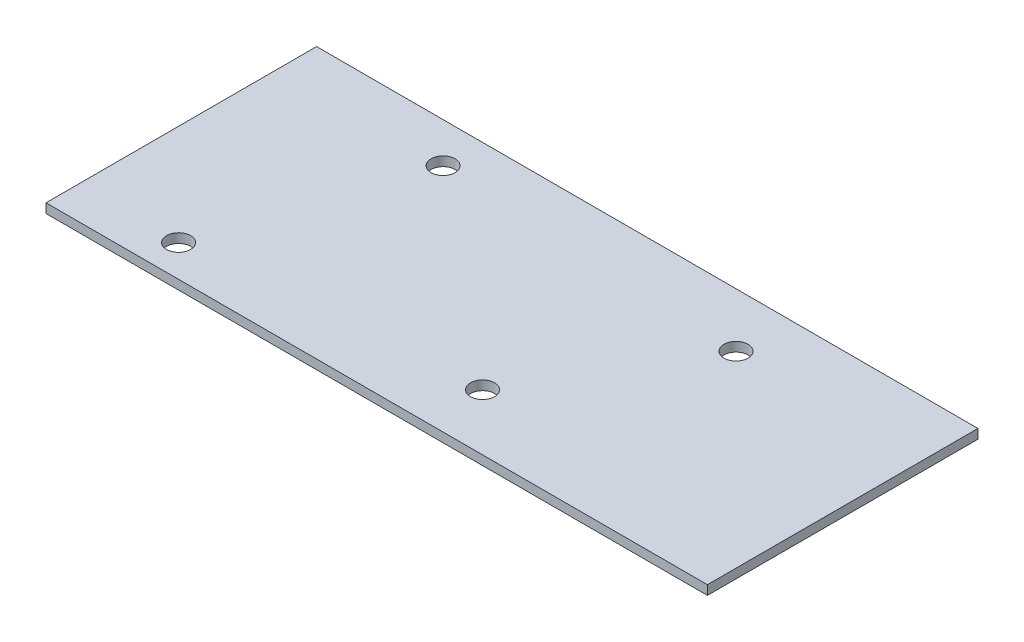
ISO-10303-21;
HEADER;
FILE_DESCRIPTION(('STEP AP214'),'2;1');
FILE_NAME('part.step','',(''),(''),'','','');
FILE_SCHEMA(('AUTOMOTIVE_DESIGN { 1 0 10303 214 1 1 1 1 }'));
ENDSEC;
DATA;
#1=APPLICATION_CONTEXT('core data for automotive mechanical design processes');
#2=APPLICATION_PROTOCOL_DEFINITION('international standard','automotive_design',2000,#1);
#3=PRODUCT_CONTEXT('',#1,'mechanical');
#4=PRODUCT('Part','Part','',(#3));
#5=PRODUCT_RELATED_PRODUCT_CATEGORY('part','',(#4));
#6=PRODUCT_DEFINITION_FORMATION('','',#4);
#7=PRODUCT_DEFINITION_CONTEXT('part definition',#1,'design');
#8=PRODUCT_DEFINITION('design','',#6,#7);
#9=PRODUCT_DEFINITION_SHAPE('','',#8);
#10=(LENGTH_UNIT() NAMED_UNIT(*) SI_UNIT(.MILLI.,.METRE.));
#11=(NAMED_UNIT(*) PLANE_ANGLE_UNIT() SI_UNIT($,.RADIAN.));
#12=(NAMED_UNIT(*) SI_UNIT($,.STERADIAN.) SOLID_ANGLE_UNIT());
#13=UNCERTAINTY_MEASURE_WITH_UNIT(LENGTH_MEASURE(1.E-05),#10,'distance_accuracy_value','');
#14=(GEOMETRIC_REPRESENTATION_CONTEXT(3) GLOBAL_UNCERTAINTY_ASSIGNED_CONTEXT((#13)) GLOBAL_UNIT_ASSIGNED_CONTEXT((#10,
#11,#12)) REPRESENTATION_CONTEXT('',''));
#15=CARTESIAN_POINT('',(0.,0.,0.));
#16=DIRECTION('',(0.,0.,1.));
#17=DIRECTION('',(1.,0.,0.));
#18=AXIS2_PLACEMENT_3D('',#15,#16,#17);
#19=CARTESIAN_POINT('',(-55.,1.55,-22.5));
#20=DIRECTION('',(1.,0.,0.));
#21=DIRECTION('',(0.,0.,-1.));
#22=AXIS2_PLACEMENT_3D('',#19,#20,#21);
#23=PLANE('',#22);
#24=DIRECTION('',(0.,0.,1.));
#25=VECTOR('',#24,1.);
#26=CARTESIAN_POINT('',(-55.,0.,-22.5));
#27=LINE('',#26,#25);
#28=CARTESIAN_POINT('',(-55.,0.,-22.5));
#29=VERTEX_POINT('',#28);
#30=CARTESIAN_POINT('',(-55.,0.,22.5));
#31=VERTEX_POINT('',#30);
#32=EDGE_CURVE('E99',#29,#31,#27,.T.);
#33=ORIENTED_EDGE('',*,*,#32,.T.);
#34=DIRECTION('',(0.,-1.,0.));
#35=VECTOR('',#34,1.);
#36=CARTESIAN_POINT('',(-55.,1.55,22.5));
#37=LINE('',#36,#35);
#38=CARTESIAN_POINT('',(-55.,1.55,22.5));
#39=VERTEX_POINT('',#38);
#40=EDGE_CURVE('E11',#39,#31,#37,.T.);
#41=ORIENTED_EDGE('',*,*,#40,.F.);
#42=DIRECTION('',(0.,0.,1.));
#43=VECTOR('',#42,1.);
#44=CARTESIAN_POINT('',(-55.,1.55,-22.5));
#45=LINE('',#44,#43);
#46=CARTESIAN_POINT('',(-55.,1.55,-22.5));
#47=VERTEX_POINT('',#46);
#48=EDGE_CURVE('E86',#47,#39,#45,.T.);
#49=ORIENTED_EDGE('',*,*,#48,.F.);
#50=DIRECTION('',(0.,-1.,0.));
#51=VECTOR('',#50,1.);
#52=CARTESIAN_POINT('',(-55.,1.55,-22.5));
#53=LINE('',#52,#51);
#54=EDGE_CURVE('E95',#47,#29,#53,.T.);
#55=ORIENTED_EDGE('',*,*,#54,.T.);
#56=EDGE_LOOP('',(#33,#41,#49,#55));
#57=FACE_BOUND('',#56,.T.);
#58=ADVANCED_FACE('F33',(#57),#23,.F.);
#59=CARTESIAN_POINT('',(-55.,1.55,22.5));
#60=DIRECTION('',(0.,0.,-1.));
#61=DIRECTION('',(-1.,0.,0.));
#62=AXIS2_PLACEMENT_3D('',#59,#60,#61);
#63=PLANE('',#62);
#64=DIRECTION('',(1.,0.,0.));
#65=VECTOR('',#64,1.);
#66=CARTESIAN_POINT('',(-55.,0.,22.5));
#67=LINE('',#66,#65);
#68=CARTESIAN_POINT('',(55.,0.,22.5));
#69=VERTEX_POINT('',#68);
#70=EDGE_CURVE('E90',#31,#69,#67,.T.);
#71=ORIENTED_EDGE('',*,*,#70,.T.);
#72=DIRECTION('',(0.,-1.,0.));
#73=VECTOR('',#72,1.);
#74=CARTESIAN_POINT('',(55.,1.55,22.5));
#75=LINE('',#74,#73);
#76=CARTESIAN_POINT('',(55.,1.55,22.5));
#77=VERTEX_POINT('',#76);
#78=EDGE_CURVE('E42',#77,#69,#75,.T.);
#79=ORIENTED_EDGE('',*,*,#78,.F.);
#80=DIRECTION('',(1.,0.,0.));
#81=VECTOR('',#80,1.);
#82=CARTESIAN_POINT('',(-55.,1.55,22.5));
#83=LINE('',#82,#81);
#84=EDGE_CURVE('E81',#39,#77,#83,.T.);
#85=ORIENTED_EDGE('',*,*,#84,.F.);
#86=ORIENTED_EDGE('',*,*,#40,.T.);
#87=EDGE_LOOP('',(#71,#79,#85,#86));
#88=FACE_BOUND('',#87,.T.);
#89=ADVANCED_FACE('F89',(#88),#63,.F.);
#90=CARTESIAN_POINT('',(55.,1.55,-22.5));
#91=DIRECTION('',(-1.,0.,0.));
#92=DIRECTION('',(0.,0.,1.));
#93=AXIS2_PLACEMENT_3D('',#90,#91,#92);
#94=PLANE('',#93);
#95=DIRECTION('',(0.,0.,-1.));
#96=VECTOR('',#95,1.);
#97=CARTESIAN_POINT('',(55.,0.,-22.5));
#98=LINE('',#97,#96);
#99=CARTESIAN_POINT('',(55.,0.,-22.5));
#100=VERTEX_POINT('',#99);
#101=EDGE_CURVE('E68',#69,#100,#98,.T.);
#102=ORIENTED_EDGE('',*,*,#101,.T.);
#103=DIRECTION('',(0.,-1.,0.));
#104=VECTOR('',#103,1.);
#105=CARTESIAN_POINT('',(55.,1.55,-22.5));
#106=LINE('',#105,#104);
#107=CARTESIAN_POINT('',(55.,1.55,-22.5));
#108=VERTEX_POINT('',#107);
#109=EDGE_CURVE('E91',#108,#100,#106,.T.);
#110=ORIENTED_EDGE('',*,*,#109,.F.);
#111=DIRECTION('',(0.,0.,-1.));
#112=VECTOR('',#111,1.);
#113=CARTESIAN_POINT('',(55.,1.55,-22.5));
#114=LINE('',#113,#112);
#115=EDGE_CURVE('E84',#77,#108,#114,.T.);
#116=ORIENTED_EDGE('',*,*,#115,.F.);
#117=ORIENTED_EDGE('',*,*,#78,.T.);
#118=EDGE_LOOP('',(#102,#110,#116,#117));
#119=FACE_BOUND('',#118,.T.);
#120=ADVANCED_FACE('F93',(#119),#94,.F.);
#121=CARTESIAN_POINT('',(-55.,1.55,-22.5));
#122=DIRECTION('',(0.,0.,1.));
#123=DIRECTION('',(1.,0.,0.));
#124=AXIS2_PLACEMENT_3D('',#121,#122,#123);
#125=PLANE('',#124);
#126=DIRECTION('',(-1.,0.,0.));
#127=VECTOR('',#126,1.);
#128=CARTESIAN_POINT('',(-55.,0.,-22.5));
#129=LINE('',#128,#127);
#130=EDGE_CURVE('E74',#100,#29,#129,.T.);
#131=ORIENTED_EDGE('',*,*,#130,.T.);
#132=ORIENTED_EDGE('',*,*,#54,.F.);
#133=DIRECTION('',(-1.,0.,0.));
#134=VECTOR('',#133,1.);
#135=CARTESIAN_POINT('',(-55.,1.55,-22.5));
#136=LINE('',#135,#134);
#137=EDGE_CURVE('E51',#108,#47,#136,.T.);
#138=ORIENTED_EDGE('',*,*,#137,.F.);
#139=ORIENTED_EDGE('',*,*,#109,.T.);
#140=EDGE_LOOP('',(#131,#132,#138,#139));
#141=FACE_BOUND('',#140,.T.);
#142=ADVANCED_FACE('F137',(#141),#125,.F.);
#143=CARTESIAN_POINT('',(0.,1.55,0.));
#144=DIRECTION('',(0.,1.,0.));
#145=DIRECTION('',(0.,0.,1.));
#146=AXIS2_PLACEMENT_3D('',#143,#144,#145);
#147=PLANE('',#146);
#148=CARTESIAN_POINT('',(8.23,1.55,13.12));
#149=DIRECTION('',(0.,1.,0.));
#150=DIRECTION('',(0.,0.,1.));
#151=AXIS2_PLACEMENT_3D('',#148,#149,#150);
#152=CIRCLE('',#151,2.);
#153=CARTESIAN_POINT('',(8.23,1.55,15.12));
#154=VERTEX_POINT('',#153);
#155=EDGE_CURVE('E126',#154,#154,#152,.T.);
#156=ORIENTED_EDGE('',*,*,#155,.F.);
#157=EDGE_LOOP('',(#156));
#158=FACE_BOUND('',#157,.T.);
#159=CARTESIAN_POINT('',(23.75,1.55,-13.5));
#160=DIRECTION('',(0.,1.,0.));
#161=DIRECTION('',(0.,0.,1.));
#162=AXIS2_PLACEMENT_3D('',#159,#160,#161);
#163=CIRCLE('',#162,2.);
#164=CARTESIAN_POINT('',(23.75,1.55,-11.5));
#165=VERTEX_POINT('',#164);
#166=EDGE_CURVE('E116',#165,#165,#163,.T.);
#167=ORIENTED_EDGE('',*,*,#166,.F.);
#168=EDGE_LOOP('',(#167));
#169=FACE_BOUND('',#168,.T.);
#170=CARTESIAN_POINT('',(-27.32,1.55,-15.86));
#171=DIRECTION('',(0.,1.,0.));
#172=DIRECTION('',(0.,0.,1.));
#173=AXIS2_PLACEMENT_3D('',#170,#171,#172);
#174=CIRCLE('',#173,2.00000000000001);
#175=CARTESIAN_POINT('',(-27.32,1.55,-13.86));
#176=VERTEX_POINT('',#175);
#177=EDGE_CURVE('E113',#176,#176,#174,.T.);
#178=ORIENTED_EDGE('',*,*,#177,.F.);
#179=EDGE_LOOP('',(#178));
#180=FACE_BOUND('',#179,.T.);
#181=CARTESIAN_POINT('',(-38.25,1.55,17.2));
#182=DIRECTION('',(0.,1.,0.));
#183=DIRECTION('',(0.,0.,1.));
#184=AXIS2_PLACEMENT_3D('',#181,#182,#183);
#185=CIRCLE('',#184,2.);
#186=CARTESIAN_POINT('',(-38.25,1.55,19.2));
#187=VERTEX_POINT('',#186);
#188=EDGE_CURVE('E110',#187,#187,#185,.T.);
#189=ORIENTED_EDGE('',*,*,#188,.F.);
#190=EDGE_LOOP('',(#189));
#191=FACE_BOUND('',#190,.T.);
#192=ORIENTED_EDGE('',*,*,#48,.T.);
#193=ORIENTED_EDGE('',*,*,#84,.T.);
#194=ORIENTED_EDGE('',*,*,#115,.T.);
#195=ORIENTED_EDGE('',*,*,#137,.T.);
#196=EDGE_LOOP('',(#192,#193,#194,#195));
#197=FACE_BOUND('',#196,.T.);
#198=ADVANCED_FACE('F82',(#158,#169,#180,#191,#197),#147,.T.);
#199=CARTESIAN_POINT('',(0.,0.,0.));
#200=DIRECTION('',(0.,1.,0.));
#201=DIRECTION('',(0.,0.,1.));
#202=AXIS2_PLACEMENT_3D('',#199,#200,#201);
#203=PLANE('',#202);
#204=CARTESIAN_POINT('',(8.23,0.,13.12));
#205=DIRECTION('',(0.,1.,0.));
#206=DIRECTION('',(0.,0.,1.));
#207=AXIS2_PLACEMENT_3D('',#204,#205,#206);
#208=CIRCLE('',#207,2.);
#209=CARTESIAN_POINT('',(8.23,0.,15.12));
#210=VERTEX_POINT('',#209);
#211=EDGE_CURVE('E36',#210,#210,#208,.T.);
#212=ORIENTED_EDGE('',*,*,#211,.T.);
#213=EDGE_LOOP('',(#212));
#214=FACE_BOUND('',#213,.T.);
#215=CARTESIAN_POINT('',(23.75,0.,-13.5));
#216=DIRECTION('',(0.,1.,0.));
#217=DIRECTION('',(0.,0.,1.));
#218=AXIS2_PLACEMENT_3D('',#215,#216,#217);
#219=CIRCLE('',#218,2.);
#220=CARTESIAN_POINT('',(23.75,0.,-11.5));
#221=VERTEX_POINT('',#220);
#222=EDGE_CURVE('E114',#221,#221,#219,.T.);
#223=ORIENTED_EDGE('',*,*,#222,.T.);
#224=EDGE_LOOP('',(#223));
#225=FACE_BOUND('',#224,.T.);
#226=CARTESIAN_POINT('',(-27.32,0.,-15.86));
#227=DIRECTION('',(0.,1.,0.));
#228=DIRECTION('',(0.,0.,1.));
#229=AXIS2_PLACEMENT_3D('',#226,#227,#228);
#230=CIRCLE('',#229,2.00000000000001);
#231=CARTESIAN_POINT('',(-27.32,0.,-13.86));
#232=VERTEX_POINT('',#231);
#233=EDGE_CURVE('E111',#232,#232,#230,.T.);
#234=ORIENTED_EDGE('',*,*,#233,.T.);
#235=EDGE_LOOP('',(#234));
#236=FACE_BOUND('',#235,.T.);
#237=CARTESIAN_POINT('',(-38.25,0.,17.2));
#238=DIRECTION('',(0.,1.,0.));
#239=DIRECTION('',(0.,0.,1.));
#240=AXIS2_PLACEMENT_3D('',#237,#238,#239);
#241=CIRCLE('',#240,2.);
#242=CARTESIAN_POINT('',(-38.25,0.,19.2));
#243=VERTEX_POINT('',#242);
#244=EDGE_CURVE('E102',#243,#243,#241,.T.);
#245=ORIENTED_EDGE('',*,*,#244,.T.);
#246=EDGE_LOOP('',(#245));
#247=FACE_BOUND('',#246,.T.);
#248=ORIENTED_EDGE('',*,*,#32,.F.);
#249=ORIENTED_EDGE('',*,*,#130,.F.);
#250=ORIENTED_EDGE('',*,*,#101,.F.);
#251=ORIENTED_EDGE('',*,*,#70,.F.);
#252=EDGE_LOOP('',(#248,#249,#250,#251));
#253=FACE_BOUND('',#252,.T.);
#254=ADVANCED_FACE('F136',(#214,#225,#236,#247,#253),#203,.F.);
#255=CARTESIAN_POINT('',(-38.25,-1.45,17.2));
#256=DIRECTION('',(0.,1.,0.));
#257=DIRECTION('',(0.,0.,1.));
#258=AXIS2_PLACEMENT_3D('',#255,#256,#257);
#259=CYLINDRICAL_SURFACE('',#258,2.);
#260=ORIENTED_EDGE('',*,*,#188,.T.);
#261=EDGE_LOOP('',(#260));
#262=FACE_BOUND('',#261,.T.);
#263=ORIENTED_EDGE('',*,*,#244,.F.);
#264=EDGE_LOOP('',(#263));
#265=FACE_BOUND('',#264,.T.);
#266=ADVANCED_FACE('F132',(#262,#265),#259,.F.);
#267=CARTESIAN_POINT('',(-27.32,-1.45,-15.86));
#268=DIRECTION('',(0.,1.,0.));
#269=DIRECTION('',(0.,0.,1.));
#270=AXIS2_PLACEMENT_3D('',#267,#268,#269);
#271=CYLINDRICAL_SURFACE('',#270,2.00000000000001);
#272=ORIENTED_EDGE('',*,*,#177,.T.);
#273=EDGE_LOOP('',(#272));
#274=FACE_BOUND('',#273,.T.);
#275=ORIENTED_EDGE('',*,*,#233,.F.);
#276=EDGE_LOOP('',(#275));
#277=FACE_BOUND('',#276,.T.);
#278=ADVANCED_FACE('F186',(#274,#277),#271,.F.);
#279=CARTESIAN_POINT('',(23.75,-1.45,-13.5));
#280=DIRECTION('',(0.,1.,0.));
#281=DIRECTION('',(0.,0.,1.));
#282=AXIS2_PLACEMENT_3D('',#279,#280,#281);
#283=CYLINDRICAL_SURFACE('',#282,2.);
#284=ORIENTED_EDGE('',*,*,#166,.T.);
#285=EDGE_LOOP('',(#284));
#286=FACE_BOUND('',#285,.T.);
#287=ORIENTED_EDGE('',*,*,#222,.F.);
#288=EDGE_LOOP('',(#287));
#289=FACE_BOUND('',#288,.T.);
#290=ADVANCED_FACE('F194',(#286,#289),#283,.F.);
#291=CARTESIAN_POINT('',(8.23,-1.45,13.12));
#292=DIRECTION('',(0.,1.,0.));
#293=DIRECTION('',(0.,0.,1.));
#294=AXIS2_PLACEMENT_3D('',#291,#292,#293);
#295=CYLINDRICAL_SURFACE('',#294,2.);
#296=ORIENTED_EDGE('',*,*,#155,.T.);
#297=EDGE_LOOP('',(#296));
#298=FACE_BOUND('',#297,.T.);
#299=ORIENTED_EDGE('',*,*,#211,.F.);
#300=EDGE_LOOP('',(#299));
#301=FACE_BOUND('',#300,.T.);
#302=ADVANCED_FACE('F204',(#298,#301),#295,.F.);
#303=CLOSED_SHELL('',(#58,#89,#120,#142,#198,#254,#266,#278,#290,#302));
#304=MANIFOLD_SOLID_BREP('B2',#303);
#305=ADVANCED_BREP_SHAPE_REPRESENTATION('',(#18,#304),#14);
#306=SHAPE_DEFINITION_REPRESENTATION(#9,#305);
ENDSEC;
END-ISO-10303-21;
